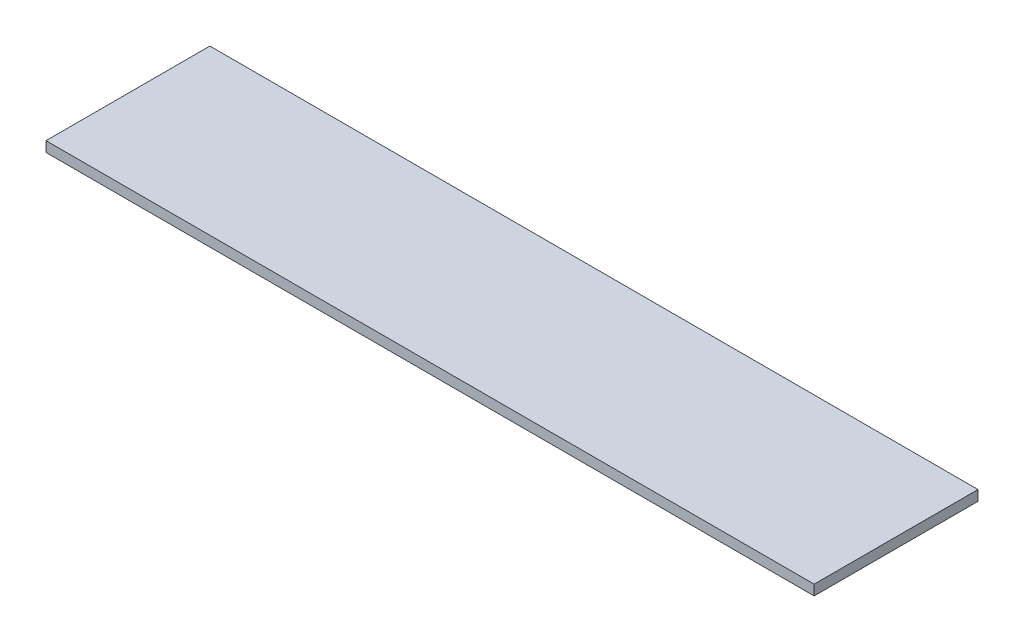
ISO-10303-21;
HEADER;
FILE_DESCRIPTION(('STEP AP214'),'2;1');
FILE_NAME('part.step','',(''),(''),'','','');
FILE_SCHEMA(('AUTOMOTIVE_DESIGN { 1 0 10303 214 1 1 1 1 }'));
ENDSEC;
DATA;
#1=APPLICATION_CONTEXT('core data for automotive mechanical design processes');
#2=APPLICATION_PROTOCOL_DEFINITION('international standard','automotive_design',2000,#1);
#3=PRODUCT_CONTEXT('',#1,'mechanical');
#4=PRODUCT('Part','Part','',(#3));
#5=PRODUCT_RELATED_PRODUCT_CATEGORY('part','',(#4));
#6=PRODUCT_DEFINITION_FORMATION('','',#4);
#7=PRODUCT_DEFINITION_CONTEXT('part definition',#1,'design');
#8=PRODUCT_DEFINITION('design','',#6,#7);
#9=PRODUCT_DEFINITION_SHAPE('','',#8);
#10=(LENGTH_UNIT() NAMED_UNIT(*) SI_UNIT(.MILLI.,.METRE.));
#11=(NAMED_UNIT(*) PLANE_ANGLE_UNIT() SI_UNIT($,.RADIAN.));
#12=(NAMED_UNIT(*) SI_UNIT($,.STERADIAN.) SOLID_ANGLE_UNIT());
#13=UNCERTAINTY_MEASURE_WITH_UNIT(LENGTH_MEASURE(1.E-05),#10,'distance_accuracy_value','');
#14=(GEOMETRIC_REPRESENTATION_CONTEXT(3) GLOBAL_UNCERTAINTY_ASSIGNED_CONTEXT((#13)) GLOBAL_UNIT_ASSIGNED_CONTEXT((#10,
#11,#12)) REPRESENTATION_CONTEXT('',''));
#15=CARTESIAN_POINT('',(0.,0.,0.));
#16=DIRECTION('',(0.,0.,1.));
#17=DIRECTION('',(1.,0.,0.));
#18=AXIS2_PLACEMENT_3D('',#15,#16,#17);
#19=CARTESIAN_POINT('',(0.,2.,-32.));
#20=DIRECTION('',(1.,0.,0.));
#21=DIRECTION('',(0.,0.,-1.));
#22=AXIS2_PLACEMENT_3D('',#19,#20,#21);
#23=PLANE('',#22);
#24=DIRECTION('',(0.,0.,1.));
#25=VECTOR('',#24,1.);
#26=CARTESIAN_POINT('',(0.,0.,-32.));
#27=LINE('',#26,#25);
#28=CARTESIAN_POINT('',(0.,0.,-32.));
#29=VERTEX_POINT('',#28);
#30=CARTESIAN_POINT('',(0.,0.,0.));
#31=VERTEX_POINT('',#30);
#32=EDGE_CURVE('E107',#29,#31,#27,.T.);
#33=ORIENTED_EDGE('',*,*,#32,.T.);
#34=DIRECTION('',(0.,-1.,0.));
#35=VECTOR('',#34,1.);
#36=CARTESIAN_POINT('',(0.,2.,0.));
#37=LINE('',#36,#35);
#38=CARTESIAN_POINT('',(0.,2.,0.));
#39=VERTEX_POINT('',#38);
#40=EDGE_CURVE('E11',#39,#31,#37,.T.);
#41=ORIENTED_EDGE('',*,*,#40,.F.);
#42=DIRECTION('',(0.,0.,1.));
#43=VECTOR('',#42,1.);
#44=CARTESIAN_POINT('',(0.,2.,-32.));
#45=LINE('',#44,#43);
#46=CARTESIAN_POINT('',(0.,2.,-32.));
#47=VERTEX_POINT('',#46);
#48=EDGE_CURVE('E91',#47,#39,#45,.T.);
#49=ORIENTED_EDGE('',*,*,#48,.F.);
#50=DIRECTION('',(0.,-1.,0.));
#51=VECTOR('',#50,1.);
#52=CARTESIAN_POINT('',(0.,2.,-32.));
#53=LINE('',#52,#51);
#54=EDGE_CURVE('E103',#47,#29,#53,.T.);
#55=ORIENTED_EDGE('',*,*,#54,.T.);
#56=EDGE_LOOP('',(#33,#41,#49,#55));
#57=FACE_BOUND('',#56,.T.);
#58=ADVANCED_FACE('F39',(#57),#23,.F.);
#59=CARTESIAN_POINT('',(0.,2.,0.));
#60=DIRECTION('',(0.,0.,-1.));
#61=DIRECTION('',(-1.,0.,0.));
#62=AXIS2_PLACEMENT_3D('',#59,#60,#61);
#63=PLANE('',#62);
#64=DIRECTION('',(1.,0.,0.));
#65=VECTOR('',#64,1.);
#66=CARTESIAN_POINT('',(0.,0.,0.));
#67=LINE('',#66,#65);
#68=CARTESIAN_POINT('',(150.,0.,0.));
#69=VERTEX_POINT('',#68);
#70=EDGE_CURVE('E96',#31,#69,#67,.T.);
#71=ORIENTED_EDGE('',*,*,#70,.T.);
#72=DIRECTION('',(0.,-1.,0.));
#73=VECTOR('',#72,1.);
#74=CARTESIAN_POINT('',(150.,2.,0.));
#75=LINE('',#74,#73);
#76=CARTESIAN_POINT('',(150.,2.,0.));
#77=VERTEX_POINT('',#76);
#78=EDGE_CURVE('E48',#77,#69,#75,.T.);
#79=ORIENTED_EDGE('',*,*,#78,.F.);
#80=DIRECTION('',(1.,0.,0.));
#81=VECTOR('',#80,1.);
#82=CARTESIAN_POINT('',(0.,2.,0.));
#83=LINE('',#82,#81);
#84=EDGE_CURVE('E86',#39,#77,#83,.T.);
#85=ORIENTED_EDGE('',*,*,#84,.F.);
#86=ORIENTED_EDGE('',*,*,#40,.T.);
#87=EDGE_LOOP('',(#71,#79,#85,#86));
#88=FACE_BOUND('',#87,.T.);
#89=ADVANCED_FACE('F95',(#88),#63,.F.);
#90=CARTESIAN_POINT('',(150.,2.,0.));
#91=DIRECTION('',(-1.,0.,0.));
#92=DIRECTION('',(0.,0.,1.));
#93=AXIS2_PLACEMENT_3D('',#90,#91,#92);
#94=PLANE('',#93);
#95=DIRECTION('',(0.,0.,-1.));
#96=VECTOR('',#95,1.);
#97=CARTESIAN_POINT('',(150.,0.,0.));
#98=LINE('',#97,#96);
#99=CARTESIAN_POINT('',(150.,0.,-32.));
#100=VERTEX_POINT('',#99);
#101=EDGE_CURVE('E73',#69,#100,#98,.T.);
#102=ORIENTED_EDGE('',*,*,#101,.T.);
#103=DIRECTION('',(0.,-1.,0.));
#104=VECTOR('',#103,1.);
#105=CARTESIAN_POINT('',(150.,2.,-32.));
#106=LINE('',#105,#104);
#107=CARTESIAN_POINT('',(150.,2.,-32.));
#108=VERTEX_POINT('',#107);
#109=EDGE_CURVE('E98',#108,#100,#106,.T.);
#110=ORIENTED_EDGE('',*,*,#109,.F.);
#111=DIRECTION('',(0.,0.,-1.));
#112=VECTOR('',#111,1.);
#113=CARTESIAN_POINT('',(150.,2.,0.));
#114=LINE('',#113,#112);
#115=EDGE_CURVE('E89',#77,#108,#114,.T.);
#116=ORIENTED_EDGE('',*,*,#115,.F.);
#117=ORIENTED_EDGE('',*,*,#78,.T.);
#118=EDGE_LOOP('',(#102,#110,#116,#117));
#119=FACE_BOUND('',#118,.T.);
#120=ADVANCED_FACE('F99',(#119),#94,.F.);
#121=CARTESIAN_POINT('',(150.,2.,-32.));
#122=DIRECTION('',(0.,0.,1.));
#123=DIRECTION('',(1.,0.,0.));
#124=AXIS2_PLACEMENT_3D('',#121,#122,#123);
#125=PLANE('',#124);
#126=DIRECTION('',(-1.,0.,0.));
#127=VECTOR('',#126,1.);
#128=CARTESIAN_POINT('',(150.,0.,-32.));
#129=LINE('',#128,#127);
#130=EDGE_CURVE('E79',#100,#29,#129,.T.);
#131=ORIENTED_EDGE('',*,*,#130,.T.);
#132=ORIENTED_EDGE('',*,*,#54,.F.);
#133=DIRECTION('',(-1.,0.,0.));
#134=VECTOR('',#133,1.);
#135=CARTESIAN_POINT('',(150.,2.,-32.));
#136=LINE('',#135,#134);
#137=EDGE_CURVE('E56',#108,#47,#136,.T.);
#138=ORIENTED_EDGE('',*,*,#137,.F.);
#139=ORIENTED_EDGE('',*,*,#109,.T.);
#140=EDGE_LOOP('',(#131,#132,#138,#139));
#141=FACE_BOUND('',#140,.T.);
#142=ADVANCED_FACE('F120',(#141),#125,.F.);
#143=CARTESIAN_POINT('',(0.,2.,0.));
#144=DIRECTION('',(0.,1.,0.));
#145=DIRECTION('',(0.,0.,1.));
#146=AXIS2_PLACEMENT_3D('',#143,#144,#145);
#147=PLANE('',#146);
#148=ORIENTED_EDGE('',*,*,#48,.T.);
#149=ORIENTED_EDGE('',*,*,#84,.T.);
#150=ORIENTED_EDGE('',*,*,#115,.T.);
#151=ORIENTED_EDGE('',*,*,#137,.T.);
#152=EDGE_LOOP('',(#148,#149,#150,#151));
#153=FACE_BOUND('',#152,.T.);
#154=ADVANCED_FACE('F87',(#153),#147,.T.);
#155=CARTESIAN_POINT('',(0.,0.,0.));
#156=DIRECTION('',(0.,1.,0.));
#157=DIRECTION('',(0.,0.,1.));
#158=AXIS2_PLACEMENT_3D('',#155,#156,#157);
#159=PLANE('',#158);
#160=ORIENTED_EDGE('',*,*,#32,.F.);
#161=ORIENTED_EDGE('',*,*,#130,.F.);
#162=ORIENTED_EDGE('',*,*,#101,.F.);
#163=ORIENTED_EDGE('',*,*,#70,.F.);
#164=EDGE_LOOP('',(#160,#161,#162,#163));
#165=FACE_BOUND('',#164,.T.);
#166=ADVANCED_FACE('F123',(#165),#159,.F.);
#167=CLOSED_SHELL('',(#58,#89,#120,#142,#154,#166));
#168=MANIFOLD_SOLID_BREP('B2',#167);
#169=ADVANCED_BREP_SHAPE_REPRESENTATION('',(#18,#168),#14);
#170=SHAPE_DEFINITION_REPRESENTATION(#9,#169);
ENDSEC;
END-ISO-10303-21;
